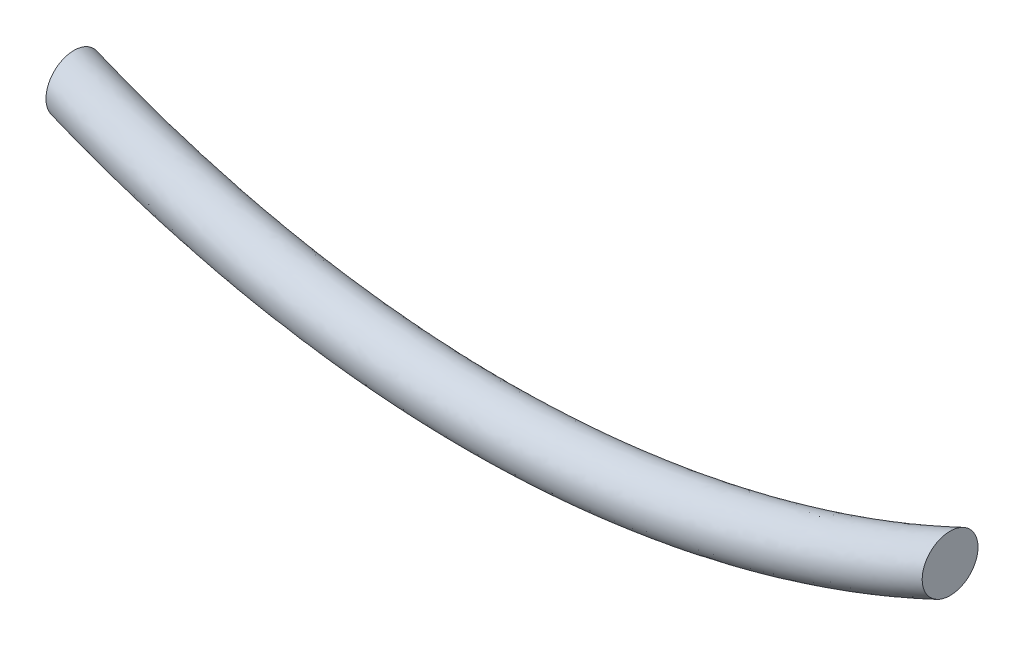
ISO-10303-21;
HEADER;
FILE_DESCRIPTION(('STEP AP214'),'2;1');
FILE_NAME('part.step','',(''),(''),'','','');
FILE_SCHEMA(('AUTOMOTIVE_DESIGN { 1 0 10303 214 1 1 1 1 }'));
ENDSEC;
DATA;
#1=APPLICATION_CONTEXT('core data for automotive mechanical design processes');
#2=APPLICATION_PROTOCOL_DEFINITION('international standard','automotive_design',2000,#1);
#3=PRODUCT_CONTEXT('',#1,'mechanical');
#4=PRODUCT('Part','Part','',(#3));
#5=PRODUCT_RELATED_PRODUCT_CATEGORY('part','',(#4));
#6=PRODUCT_DEFINITION_FORMATION('','',#4);
#7=PRODUCT_DEFINITION_CONTEXT('part definition',#1,'design');
#8=PRODUCT_DEFINITION('design','',#6,#7);
#9=PRODUCT_DEFINITION_SHAPE('','',#8);
#10=(LENGTH_UNIT() NAMED_UNIT(*) SI_UNIT(.MILLI.,.METRE.));
#11=(NAMED_UNIT(*) PLANE_ANGLE_UNIT() SI_UNIT($,.RADIAN.));
#12=(NAMED_UNIT(*) SI_UNIT($,.STERADIAN.) SOLID_ANGLE_UNIT());
#13=UNCERTAINTY_MEASURE_WITH_UNIT(LENGTH_MEASURE(1.E-05),#10,'distance_accuracy_value','');
#14=(GEOMETRIC_REPRESENTATION_CONTEXT(3) GLOBAL_UNCERTAINTY_ASSIGNED_CONTEXT((#13)) GLOBAL_UNIT_ASSIGNED_CONTEXT((#10,
#11,#12)) REPRESENTATION_CONTEXT('',''));
#15=CARTESIAN_POINT('',(0.,0.,0.));
#16=DIRECTION('',(0.,0.,1.));
#17=DIRECTION('',(1.,0.,0.));
#18=AXIS2_PLACEMENT_3D('',#15,#16,#17);
#19=CARTESIAN_POINT('',(-1.06592843047935,0.042682034226541,5.));
#20=DIRECTION('',(-1.,0.,0.));
#21=DIRECTION('',(0.,0.,1.));
#22=AXIS2_PLACEMENT_3D('',#19,#20,#21);
#23=PLANE('',#22);
#24=CARTESIAN_POINT('',(-1.06592843047935,0.0426820342265405,0.));
#25=CARTESIAN_POINT('',(-1.06592843047935,0.111671410466928,0.));
#26=CARTESIAN_POINT('',(-1.06592843047935,0.248352287699625,0.00560106237596121));
#27=CARTESIAN_POINT('',(-1.06592843047935,0.448834499735257,0.0301603649986038));
#28=CARTESIAN_POINT('',(-1.06592843047935,0.644132129888291,0.0702318986107657));
#29=CARTESIAN_POINT('',(-1.06592843047935,1.78093755109581,0.399861617805753));
#30=CARTESIAN_POINT('',(-1.06592843047935,2.54268203422654,1.3961699801538));
#31=CARTESIAN_POINT('',(-1.06592843047935,2.54268203422654,3.87978752480775));
#32=CARTESIAN_POINT('',(-1.06592843047935,1.42246955903429,5.));
#33=CARTESIAN_POINT('',(-1.06592843047935,-1.33710549058121,5.));
#34=CARTESIAN_POINT('',(-1.06592843047935,-2.45731796577346,3.87978752480775));
#35=CARTESIAN_POINT('',(-1.06592843047935,-2.45731796577346,1.3961699801538));
#36=CARTESIAN_POINT('',(-1.06592843047935,-1.69557348264273,0.399861617805752));
#37=CARTESIAN_POINT('',(-1.06592843047935,-0.55876806143521,0.0702318986107661));
#38=CARTESIAN_POINT('',(-1.06592843047935,-0.363470431282176,0.0301603649986043));
#39=CARTESIAN_POINT('',(-1.06592843047935,-0.162988219246544,0.00560106237596121));
#40=CARTESIAN_POINT('',(-1.06592843047935,-0.0263073420138468,0.));
#41=CARTESIAN_POINT('',(-1.06592843047935,0.0426820342265405,0.));
#42=B_SPLINE_CURVE_WITH_KNOTS('',3,(#24,#25,#26,#27,#28,#29,#30,#31,#32,#33,#34,#35,#36,#37,#38,
#39,#40,#41),.UNSPECIFIED.,.T.,.F.,(4,1,1,1,1,2,2,2,1,1,1,1,4),(0.,0.0125,0.0249999999999999,
0.0375000000000001,0.05,0.25,0.5,0.75,0.95,0.9625,0.975,0.9875,1.),.UNSPECIFIED.);
#43=CARTESIAN_POINT('',(-1.06592843047935,0.0426820342265405,0.));
#44=VERTEX_POINT('',#43);
#45=EDGE_CURVE('E48',#44,#44,#42,.T.);
#46=ORIENTED_EDGE('',*,*,#45,.F.);
#47=EDGE_LOOP('',(#46));
#48=FACE_BOUND('',#47,.T.);
#49=ADVANCED_FACE('F39',(#48),#23,.T.);
#50=CARTESIAN_POINT('',(77.4042565201132,1.99144938856034,5.));
#51=DIRECTION('',(-1.,0.,0.));
#52=DIRECTION('',(0.,0.,1.));
#53=AXIS2_PLACEMENT_3D('',#50,#51,#52);
#54=PLANE('',#53);
#55=CARTESIAN_POINT('',(77.4042565201132,1.99144938856034,0.));
#56=CARTESIAN_POINT('',(77.4042565201132,2.06043876480073,0.));
#57=CARTESIAN_POINT('',(77.4042565201132,2.19711964203343,0.00560106237596121));
#58=CARTESIAN_POINT('',(77.4042565201132,2.39760185406906,0.0301603649986043));
#59=CARTESIAN_POINT('',(77.4042565201132,2.59289948422209,0.0702318986107661));
#60=CARTESIAN_POINT('',(77.4042565201132,3.72970490542961,0.399861617805753));
#61=CARTESIAN_POINT('',(77.4042565201132,4.49144938856034,1.3961699801538));
#62=CARTESIAN_POINT('',(77.4042565201132,4.49144938856034,3.87978752480775));
#63=CARTESIAN_POINT('',(77.4042565201132,3.37123691336809,5.));
#64=CARTESIAN_POINT('',(77.4042565201132,0.611661863752593,5.));
#65=CARTESIAN_POINT('',(77.4042565201132,-0.508550611439657,3.87978752480775));
#66=CARTESIAN_POINT('',(77.4042565201132,-0.508550611439658,1.3961699801538));
#67=CARTESIAN_POINT('',(77.4042565201132,0.253193871691072,0.399861617805753));
#68=CARTESIAN_POINT('',(77.4042565201132,1.38999929289859,0.0702318986107661));
#69=CARTESIAN_POINT('',(77.4042565201132,1.58529692305163,0.0301603649986043));
#70=CARTESIAN_POINT('',(77.4042565201132,1.78577913508726,0.00560106237596121));
#71=CARTESIAN_POINT('',(77.4042565201132,1.92246001231996,0.));
#72=CARTESIAN_POINT('',(77.4042565201132,1.99144938856034,0.));
#73=B_SPLINE_CURVE_WITH_KNOTS('',3,(#55,#56,#57,#58,#59,#60,#61,#62,#63,#64,#65,#66,#67,#68,#69,
#70,#71,#72),.UNSPECIFIED.,.T.,.F.,(4,1,1,1,1,2,2,2,1,1,1,1,4),(0.,0.0125,0.0249999999999999,
0.0375000000000001,0.05,0.25,0.5,0.75,0.95,0.9625,0.975,0.9875,1.),.UNSPECIFIED.);
#74=CARTESIAN_POINT('',(77.4042565201132,1.99144938856034,0.));
#75=VERTEX_POINT('',#74);
#76=EDGE_CURVE('E11',#75,#75,#73,.F.);
#77=ORIENTED_EDGE('',*,*,#76,.F.);
#78=EDGE_LOOP('',(#77));
#79=FACE_BOUND('',#78,.T.);
#80=ADVANCED_FACE('F41',(#79),#54,.F.);
#81=CARTESIAN_POINT('',(-1.06592843047935,0.0426820342265405,0.));
#82=CARTESIAN_POINT('',(24.1956446792679,-10.3922058474282,0.));
#83=CARTESIAN_POINT('',(52.6917953266141,-9.68451835898026,0.));
#84=CARTESIAN_POINT('',(77.4042565201132,1.99144938856034,0.));
#85=CARTESIAN_POINT('',(-1.06592843047935,0.111671410466928,0.));
#86=CARTESIAN_POINT('',(24.1956446792679,-10.3232164711878,0.));
#87=CARTESIAN_POINT('',(52.6917953266141,-9.61552898273988,0.));
#88=CARTESIAN_POINT('',(77.4042565201132,2.06043876480073,0.));
#89=CARTESIAN_POINT('',(-1.06592843047935,0.248352287699625,0.00560106237596121));
#90=CARTESIAN_POINT('',(24.1956446792679,-10.1865355939551,0.00560106237596121));
#91=CARTESIAN_POINT('',(52.6917953266141,-9.47884810550718,0.00560106237596164));
#92=CARTESIAN_POINT('',(77.4042565201132,2.19711964203343,0.00560106237596121));
#93=CARTESIAN_POINT('',(-1.06592843047935,0.448834499735257,0.0301603649986038));
#94=CARTESIAN_POINT('',(24.1956446792679,-9.98605338191944,0.0301603649986043));
#95=CARTESIAN_POINT('',(52.6917953266141,-9.27836589347155,0.0301603649986047));
#96=CARTESIAN_POINT('',(77.4042565201132,2.39760185406906,0.0301603649986043));
#97=CARTESIAN_POINT('',(-1.06592843047935,0.644132129888291,0.0702318986107657));
#98=CARTESIAN_POINT('',(24.1956446792679,-9.79075575176641,0.0702318986107661));
#99=CARTESIAN_POINT('',(52.6917953266141,-9.08306826331852,0.0702318986107661));
#100=CARTESIAN_POINT('',(77.4042565201132,2.59289948422209,0.0702318986107661));
#101=CARTESIAN_POINT('',(-1.06592843047935,1.78093755109581,0.399861617805753));
#102=CARTESIAN_POINT('',(24.1956446792679,-8.65395033055889,0.399861617805753));
#103=CARTESIAN_POINT('',(52.6917953266141,-7.94626284211099,0.399861617805753));
#104=CARTESIAN_POINT('',(77.4042565201132,3.72970490542961,0.399861617805753));
#105=CARTESIAN_POINT('',(-1.06592843047935,2.54268203422654,1.3961699801538));
#106=CARTESIAN_POINT('',(24.1956446792679,-7.89220584742816,1.3961699801538));
#107=CARTESIAN_POINT('',(52.6917953266141,-7.18451835898026,1.3961699801538));
#108=CARTESIAN_POINT('',(77.4042565201132,4.49144938856034,1.3961699801538));
#109=CARTESIAN_POINT('',(-1.06592843047935,2.54268203422654,3.87978752480775));
#110=CARTESIAN_POINT('',(24.1956446792679,-7.89220584742816,3.87978752480775));
#111=CARTESIAN_POINT('',(52.6917953266141,-7.18451835898026,3.87978752480775));
#112=CARTESIAN_POINT('',(77.4042565201132,4.49144938856034,3.87978752480775));
#113=CARTESIAN_POINT('',(-1.06592843047935,1.42246955903429,5.));
#114=CARTESIAN_POINT('',(24.1956446792679,-9.01241832262041,5.));
#115=CARTESIAN_POINT('',(52.6917953266141,-8.30473083417252,5.));
#116=CARTESIAN_POINT('',(77.4042565201132,3.37123691336809,5.));
#117=CARTESIAN_POINT('',(-1.06592843047935,-1.33710549058121,5.));
#118=CARTESIAN_POINT('',(24.1956446792679,-11.7719933722359,5.));
#119=CARTESIAN_POINT('',(52.6917953266141,-11.064305883788,5.));
#120=CARTESIAN_POINT('',(77.4042565201132,0.611661863752593,5.));
#121=CARTESIAN_POINT('',(-1.06592843047935,-2.45731796577346,3.87978752480775));
#122=CARTESIAN_POINT('',(24.1956446792679,-12.8922058474282,3.87978752480775));
#123=CARTESIAN_POINT('',(52.6917953266141,-12.1845183589803,3.87978752480775));
#124=CARTESIAN_POINT('',(77.4042565201132,-0.508550611439657,3.87978752480775));
#125=CARTESIAN_POINT('',(-1.06592843047935,-2.45731796577346,1.3961699801538));
#126=CARTESIAN_POINT('',(24.1956446792679,-12.8922058474282,1.3961699801538));
#127=CARTESIAN_POINT('',(52.6917953266141,-12.1845183589803,1.3961699801538));
#128=CARTESIAN_POINT('',(77.4042565201132,-0.508550611439658,1.3961699801538));
#129=CARTESIAN_POINT('',(-1.06592843047935,-1.69557348264273,0.399861617805752));
#130=CARTESIAN_POINT('',(24.1956446792679,-12.1304613642974,0.399861617805752));
#131=CARTESIAN_POINT('',(52.6917953266141,-11.4227738758495,0.399861617805753));
#132=CARTESIAN_POINT('',(77.4042565201132,0.253193871691072,0.399861617805753));
#133=CARTESIAN_POINT('',(-1.06592843047935,-0.55876806143521,0.0702318986107661));
#134=CARTESIAN_POINT('',(24.1956446792679,-10.9936559430899,0.0702318986107661));
#135=CARTESIAN_POINT('',(52.6917953266141,-10.285968454642,0.0702318986107661));
#136=CARTESIAN_POINT('',(77.4042565201132,1.38999929289859,0.0702318986107661));
#137=CARTESIAN_POINT('',(-1.06592843047935,-0.363470431282176,0.0301603649986043));
#138=CARTESIAN_POINT('',(24.1956446792679,-10.7983583129369,0.0301603649986047));
#139=CARTESIAN_POINT('',(52.6917953266141,-10.090670824489,0.0301603649986047));
#140=CARTESIAN_POINT('',(77.4042565201132,1.58529692305163,0.0301603649986043));
#141=CARTESIAN_POINT('',(-1.06592843047935,-0.162988219246544,0.00560106237596121));
#142=CARTESIAN_POINT('',(24.1956446792679,-10.5978761009012,0.00560106237596121));
#143=CARTESIAN_POINT('',(52.6917953266141,-9.89018861245335,0.00560106237596164));
#144=CARTESIAN_POINT('',(77.4042565201132,1.78577913508726,0.00560106237596121));
#145=CARTESIAN_POINT('',(-1.06592843047935,-0.0263073420138468,0.));
#146=CARTESIAN_POINT('',(24.1956446792679,-10.4611952236685,0.));
#147=CARTESIAN_POINT('',(52.6917953266141,-9.75350773522065,0.));
#148=CARTESIAN_POINT('',(77.4042565201132,1.92246001231996,0.));
#149=CARTESIAN_POINT('',(-1.06592843047935,0.0426820342265405,0.));
#150=CARTESIAN_POINT('',(24.1956446792679,-10.3922058474282,0.));
#151=CARTESIAN_POINT('',(52.6917953266141,-9.68451835898026,0.));
#152=CARTESIAN_POINT('',(77.4042565201132,1.99144938856034,0.));
#153=B_SPLINE_SURFACE_WITH_KNOTS('',3,3,((#81,#82,#83,#84),(#85,#86,#87,#88),(#89,#90,#91,#92),
(#93,#94,#95,#96),(#97,#98,#99,#100),(#101,#102,#103,#104),(#105,#106,#107,#108),(#109,#110,
#111,#112),(#113,#114,#115,#116),(#117,#118,#119,#120),(#121,#122,#123,#124),(#125,#126,#127,
#128),(#129,#130,#131,#132),(#133,#134,#135,#136),(#137,#138,#139,#140),(#141,#142,#143,#144),
(#145,#146,#147,#148),(#149,#150,#151,#152)),.UNSPECIFIED.,.T.,.F.,.F.,(4,1,1,1,1,2,2,2,1,1,1,1,
4),(4,4),(0.,0.0125,0.0249999999999999,0.0375000000000001,0.05,0.25,0.5,0.75,0.95,0.9625,0.975,
0.9875,1.),(0.,1.),.UNSPECIFIED.);
#154=ORIENTED_EDGE('',*,*,#45,.T.);
#155=EDGE_LOOP('',(#154));
#156=FACE_BOUND('',#155,.T.);
#157=ORIENTED_EDGE('',*,*,#76,.T.);
#158=EDGE_LOOP('',(#157));
#159=FACE_BOUND('',#158,.T.);
#160=ADVANCED_FACE('F59',(#156,#159),#153,.T.);
#161=CLOSED_SHELL('',(#49,#80,#160));
#162=MANIFOLD_SOLID_BREP('B2',#161);
#163=ADVANCED_BREP_SHAPE_REPRESENTATION('',(#18,#162),#14);
#164=SHAPE_DEFINITION_REPRESENTATION(#9,#163);
ENDSEC;
END-ISO-10303-21;
